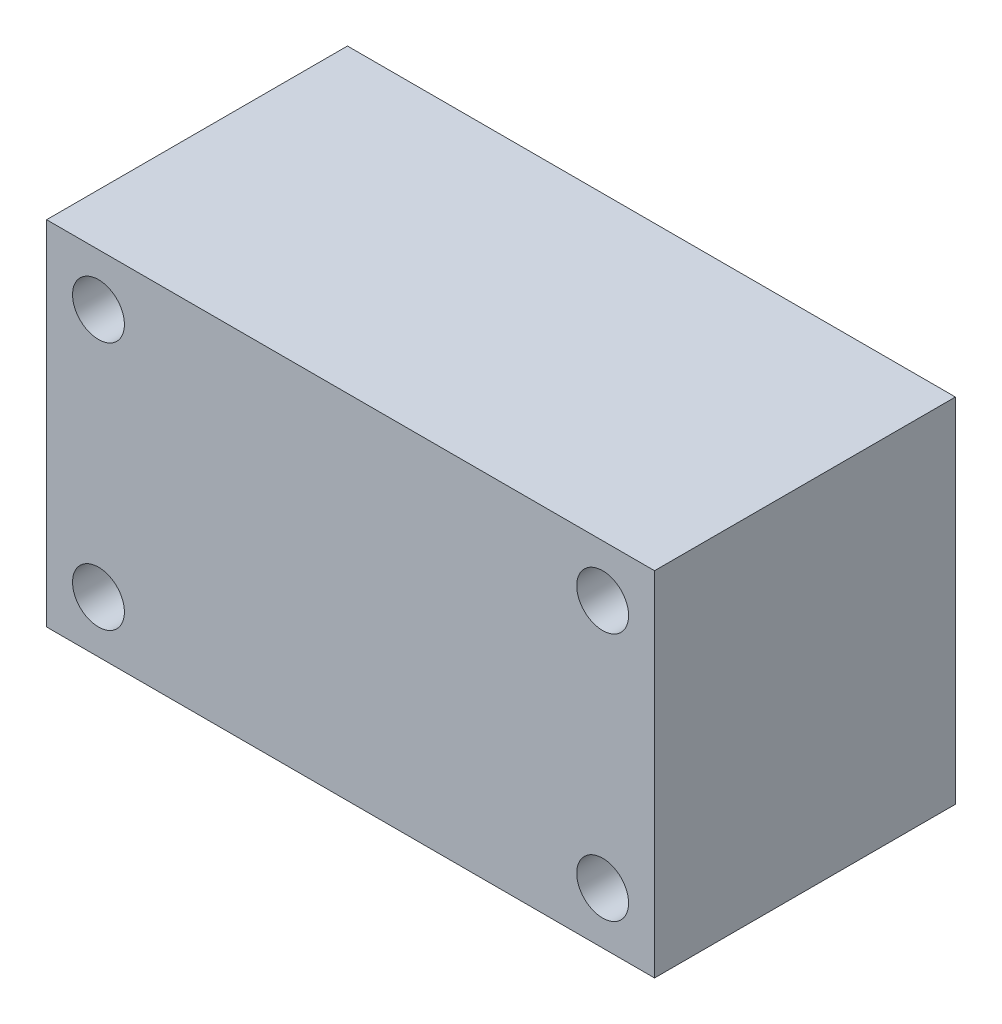
ISO-10303-21;
HEADER;
FILE_DESCRIPTION(('STEP AP214'),'2;1');
FILE_NAME('part.step','',(''),(''),'','','');
FILE_SCHEMA(('AUTOMOTIVE_DESIGN { 1 0 10303 214 1 1 1 1 }'));
ENDSEC;
DATA;
#1=APPLICATION_CONTEXT('core data for automotive mechanical design processes');
#2=APPLICATION_PROTOCOL_DEFINITION('international standard','automotive_design',2000,#1);
#3=PRODUCT_CONTEXT('',#1,'mechanical');
#4=PRODUCT('Part','Part','',(#3));
#5=PRODUCT_RELATED_PRODUCT_CATEGORY('part','',(#4));
#6=PRODUCT_DEFINITION_FORMATION('','',#4);
#7=PRODUCT_DEFINITION_CONTEXT('part definition',#1,'design');
#8=PRODUCT_DEFINITION('design','',#6,#7);
#9=PRODUCT_DEFINITION_SHAPE('','',#8);
#10=(LENGTH_UNIT() NAMED_UNIT(*) SI_UNIT(.MILLI.,.METRE.));
#11=(NAMED_UNIT(*) PLANE_ANGLE_UNIT() SI_UNIT($,.RADIAN.));
#12=(NAMED_UNIT(*) SI_UNIT($,.STERADIAN.) SOLID_ANGLE_UNIT());
#13=UNCERTAINTY_MEASURE_WITH_UNIT(LENGTH_MEASURE(1.E-05),#10,'distance_accuracy_value','');
#14=(GEOMETRIC_REPRESENTATION_CONTEXT(3) GLOBAL_UNCERTAINTY_ASSIGNED_CONTEXT((#13)) GLOBAL_UNIT_ASSIGNED_CONTEXT((#10,
#11,#12)) REPRESENTATION_CONTEXT('',''));
#15=CARTESIAN_POINT('',(0.,0.,0.));
#16=DIRECTION('',(0.,0.,1.));
#17=DIRECTION('',(1.,0.,0.));
#18=AXIS2_PLACEMENT_3D('',#15,#16,#17);
#19=CARTESIAN_POINT('',(12.15,6.,-20.5));
#20=DIRECTION('',(0.,0.,-1.));
#21=DIRECTION('',(1.,0.,0.));
#22=AXIS2_PLACEMENT_3D('',#19,#20,#21);
#23=CYLINDRICAL_SURFACE('',#22,1.25);
#24=CARTESIAN_POINT('',(12.15,6.,-19.5));
#25=DIRECTION('',(0.,0.,-1.));
#26=DIRECTION('',(1.,0.,0.));
#27=AXIS2_PLACEMENT_3D('',#24,#25,#26);
#28=CIRCLE('',#27,1.25);
#29=CARTESIAN_POINT('',(13.4,6.,-19.5));
#30=VERTEX_POINT('',#29);
#31=EDGE_CURVE('E86',#30,#30,#28,.T.);
#32=ORIENTED_EDGE('',*,*,#31,.T.);
#33=DIRECTION('',(0.,0.,1.));
#34=VECTOR('',#33,1.);
#35=CARTESIAN_POINT('',(13.4,6.,-20.5));
#36=LINE('',#35,#34);
#37=CARTESIAN_POINT('',(13.4,6.,-5.));
#38=VERTEX_POINT('',#37);
#39=EDGE_CURVE('E9',#30,#38,#36,.T.);
#40=ORIENTED_EDGE('',*,*,#39,.T.);
#41=CARTESIAN_POINT('',(12.15,6.,-5.));
#42=DIRECTION('',(0.,0.,-1.));
#43=DIRECTION('',(1.,0.,0.));
#44=AXIS2_PLACEMENT_3D('',#41,#42,#43);
#45=CIRCLE('',#44,1.25);
#46=EDGE_CURVE('E90',#38,#38,#45,.T.);
#47=ORIENTED_EDGE('',*,*,#46,.F.);
#48=ORIENTED_EDGE('',*,*,#39,.F.);
#49=EDGE_LOOP('',(#32,#40,#47,#48));
#50=FACE_BOUND('',#49,.T.);
#51=ADVANCED_FACE('F15',(#50),#23,.F.);
#52=CARTESIAN_POINT('',(-12.15,6.,-20.5));
#53=DIRECTION('',(0.,0.,-1.));
#54=DIRECTION('',(1.,0.,0.));
#55=AXIS2_PLACEMENT_3D('',#52,#53,#54);
#56=CYLINDRICAL_SURFACE('',#55,1.25);
#57=CARTESIAN_POINT('',(-12.15,6.,-19.5));
#58=DIRECTION('',(0.,0.,-1.));
#59=DIRECTION('',(1.,0.,0.));
#60=AXIS2_PLACEMENT_3D('',#57,#58,#59);
#61=CIRCLE('',#60,1.25);
#62=CARTESIAN_POINT('',(-10.9,6.,-19.5));
#63=VERTEX_POINT('',#62);
#64=EDGE_CURVE('E111',#63,#63,#61,.T.);
#65=ORIENTED_EDGE('',*,*,#64,.T.);
#66=DIRECTION('',(0.,0.,1.));
#67=VECTOR('',#66,1.);
#68=CARTESIAN_POINT('',(-10.9,6.,-20.5));
#69=LINE('',#68,#67);
#70=CARTESIAN_POINT('',(-10.9,6.,-5.));
#71=VERTEX_POINT('',#70);
#72=EDGE_CURVE('E24',#63,#71,#69,.T.);
#73=ORIENTED_EDGE('',*,*,#72,.T.);
#74=CARTESIAN_POINT('',(-12.15,6.,-5.));
#75=DIRECTION('',(0.,0.,-1.));
#76=DIRECTION('',(1.,0.,0.));
#77=AXIS2_PLACEMENT_3D('',#74,#75,#76);
#78=CIRCLE('',#77,1.25);
#79=EDGE_CURVE('E91',#71,#71,#78,.T.);
#80=ORIENTED_EDGE('',*,*,#79,.F.);
#81=ORIENTED_EDGE('',*,*,#72,.F.);
#82=EDGE_LOOP('',(#65,#73,#80,#81));
#83=FACE_BOUND('',#82,.T.);
#84=ADVANCED_FACE('F115',(#83),#56,.F.);
#85=CARTESIAN_POINT('',(12.15,-6.,-20.5));
#86=DIRECTION('',(0.,0.,-1.));
#87=DIRECTION('',(1.,0.,0.));
#88=AXIS2_PLACEMENT_3D('',#85,#86,#87);
#89=CYLINDRICAL_SURFACE('',#88,1.25);
#90=CARTESIAN_POINT('',(12.15,-6.,-19.5));
#91=DIRECTION('',(0.,0.,-1.));
#92=DIRECTION('',(1.,0.,0.));
#93=AXIS2_PLACEMENT_3D('',#90,#91,#92);
#94=CIRCLE('',#93,1.25);
#95=CARTESIAN_POINT('',(13.4,-6.,-19.5));
#96=VERTEX_POINT('',#95);
#97=EDGE_CURVE('E161',#96,#96,#94,.T.);
#98=ORIENTED_EDGE('',*,*,#97,.T.);
#99=DIRECTION('',(0.,0.,1.));
#100=VECTOR('',#99,1.);
#101=CARTESIAN_POINT('',(13.4,-6.,-20.5));
#102=LINE('',#101,#100);
#103=CARTESIAN_POINT('',(13.4,-6.,-5.));
#104=VERTEX_POINT('',#103);
#105=EDGE_CURVE('E97',#96,#104,#102,.T.);
#106=ORIENTED_EDGE('',*,*,#105,.T.);
#107=CARTESIAN_POINT('',(12.15,-6.,-5.));
#108=DIRECTION('',(0.,0.,-1.));
#109=DIRECTION('',(1.,0.,0.));
#110=AXIS2_PLACEMENT_3D('',#107,#108,#109);
#111=CIRCLE('',#110,1.25);
#112=EDGE_CURVE('E105',#104,#104,#111,.T.);
#113=ORIENTED_EDGE('',*,*,#112,.F.);
#114=ORIENTED_EDGE('',*,*,#105,.F.);
#115=EDGE_LOOP('',(#98,#106,#113,#114));
#116=FACE_BOUND('',#115,.T.);
#117=ADVANCED_FACE('F222',(#116),#89,.F.);
#118=CARTESIAN_POINT('',(-12.15,-6.,-20.5));
#119=DIRECTION('',(0.,0.,-1.));
#120=DIRECTION('',(1.,0.,0.));
#121=AXIS2_PLACEMENT_3D('',#118,#119,#120);
#122=CYLINDRICAL_SURFACE('',#121,1.25);
#123=CARTESIAN_POINT('',(-12.15,-6.,-19.5));
#124=DIRECTION('',(0.,0.,-1.));
#125=DIRECTION('',(1.,0.,0.));
#126=AXIS2_PLACEMENT_3D('',#123,#124,#125);
#127=CIRCLE('',#126,1.25);
#128=CARTESIAN_POINT('',(-10.9,-6.,-19.5));
#129=VERTEX_POINT('',#128);
#130=EDGE_CURVE('E173',#129,#129,#127,.T.);
#131=ORIENTED_EDGE('',*,*,#130,.T.);
#132=DIRECTION('',(0.,0.,1.));
#133=VECTOR('',#132,1.);
#134=CARTESIAN_POINT('',(-10.9,-6.,-20.5));
#135=LINE('',#134,#133);
#136=CARTESIAN_POINT('',(-10.9,-6.,-5.));
#137=VERTEX_POINT('',#136);
#138=EDGE_CURVE('E95',#129,#137,#135,.T.);
#139=ORIENTED_EDGE('',*,*,#138,.T.);
#140=CARTESIAN_POINT('',(-12.15,-6.,-5.));
#141=DIRECTION('',(0.,0.,-1.));
#142=DIRECTION('',(1.,0.,0.));
#143=AXIS2_PLACEMENT_3D('',#140,#141,#142);
#144=CIRCLE('',#143,1.25);
#145=EDGE_CURVE('E128',#137,#137,#144,.T.);
#146=ORIENTED_EDGE('',*,*,#145,.F.);
#147=ORIENTED_EDGE('',*,*,#138,.F.);
#148=EDGE_LOOP('',(#131,#139,#146,#147));
#149=FACE_BOUND('',#148,.T.);
#150=ADVANCED_FACE('F258',(#149),#122,.F.);
#151=CARTESIAN_POINT('',(14.65,8.5,-19.5));
#152=DIRECTION('',(0.,-1.,0.));
#153=DIRECTION('',(0.,0.,-1.));
#154=AXIS2_PLACEMENT_3D('',#151,#152,#153);
#155=PLANE('',#154);
#156=DIRECTION('',(-1.,0.,0.));
#157=VECTOR('',#156,1.);
#158=CARTESIAN_POINT('',(14.65,8.5,-19.5));
#159=LINE('',#158,#157);
#160=CARTESIAN_POINT('',(14.65,8.5,-19.5));
#161=VERTEX_POINT('',#160);
#162=CARTESIAN_POINT('',(-14.65,8.5,-19.5));
#163=VERTEX_POINT('',#162);
#164=EDGE_CURVE('E179',#161,#163,#159,.T.);
#165=ORIENTED_EDGE('',*,*,#164,.T.);
#166=DIRECTION('',(0.,0.,1.));
#167=VECTOR('',#166,1.);
#168=CARTESIAN_POINT('',(-14.65,8.5,-19.5));
#169=LINE('',#168,#167);
#170=CARTESIAN_POINT('',(-14.65,8.5,-5.));
#171=VERTEX_POINT('',#170);
#172=EDGE_CURVE('E163',#163,#171,#169,.T.);
#173=ORIENTED_EDGE('',*,*,#172,.T.);
#174=DIRECTION('',(-1.,0.,0.));
#175=VECTOR('',#174,1.);
#176=CARTESIAN_POINT('',(14.65,8.5,-5.));
#177=LINE('',#176,#175);
#178=CARTESIAN_POINT('',(14.65,8.5,-5.));
#179=VERTEX_POINT('',#178);
#180=EDGE_CURVE('E191',#179,#171,#177,.T.);
#181=ORIENTED_EDGE('',*,*,#180,.F.);
#182=DIRECTION('',(0.,0.,1.));
#183=VECTOR('',#182,1.);
#184=CARTESIAN_POINT('',(14.65,8.5,-19.5));
#185=LINE('',#184,#183);
#186=EDGE_CURVE('E162',#161,#179,#185,.T.);
#187=ORIENTED_EDGE('',*,*,#186,.F.);
#188=EDGE_LOOP('',(#165,#173,#181,#187));
#189=FACE_BOUND('',#188,.T.);
#190=ADVANCED_FACE('F120',(#189),#155,.F.);
#191=CARTESIAN_POINT('',(0.,0.,-5.));
#192=DIRECTION('',(0.,0.,1.));
#193=DIRECTION('',(1.,0.,0.));
#194=AXIS2_PLACEMENT_3D('',#191,#192,#193);
#195=PLANE('',#194);
#196=ORIENTED_EDGE('',*,*,#46,.T.);
#197=EDGE_LOOP('',(#196));
#198=FACE_BOUND('',#197,.T.);
#199=ORIENTED_EDGE('',*,*,#79,.T.);
#200=EDGE_LOOP('',(#199));
#201=FACE_BOUND('',#200,.T.);
#202=ORIENTED_EDGE('',*,*,#112,.T.);
#203=EDGE_LOOP('',(#202));
#204=FACE_BOUND('',#203,.T.);
#205=ORIENTED_EDGE('',*,*,#145,.T.);
#206=EDGE_LOOP('',(#205));
#207=FACE_BOUND('',#206,.T.);
#208=DIRECTION('',(1.,0.,0.));
#209=VECTOR('',#208,1.);
#210=CARTESIAN_POINT('',(-14.65,-8.5,-5.));
#211=LINE('',#210,#209);
#212=CARTESIAN_POINT('',(-14.65,-8.5,-5.));
#213=VERTEX_POINT('',#212);
#214=CARTESIAN_POINT('',(14.65,-8.5,-5.));
#215=VERTEX_POINT('',#214);
#216=EDGE_CURVE('E135',#213,#215,#211,.T.);
#217=ORIENTED_EDGE('',*,*,#216,.T.);
#218=DIRECTION('',(0.,1.,0.));
#219=VECTOR('',#218,1.);
#220=CARTESIAN_POINT('',(14.65,-8.5,-5.));
#221=LINE('',#220,#219);
#222=EDGE_CURVE('E133',#215,#179,#221,.T.);
#223=ORIENTED_EDGE('',*,*,#222,.T.);
#224=ORIENTED_EDGE('',*,*,#180,.T.);
#225=DIRECTION('',(0.,-1.,0.));
#226=VECTOR('',#225,1.);
#227=CARTESIAN_POINT('',(-14.65,8.5,-5.));
#228=LINE('',#227,#226);
#229=EDGE_CURVE('E140',#171,#213,#228,.T.);
#230=ORIENTED_EDGE('',*,*,#229,.T.);
#231=EDGE_LOOP('',(#217,#223,#224,#230));
#232=FACE_BOUND('',#231,.T.);
#233=ADVANCED_FACE('F116',(#198,#201,#204,#207,#232),#195,.T.);
#234=CARTESIAN_POINT('',(0.,0.,-19.5));
#235=DIRECTION('',(0.,0.,1.));
#236=DIRECTION('',(1.,0.,0.));
#237=AXIS2_PLACEMENT_3D('',#234,#235,#236);
#238=PLANE('',#237);
#239=ORIENTED_EDGE('',*,*,#31,.F.);
#240=EDGE_LOOP('',(#239));
#241=FACE_BOUND('',#240,.T.);
#242=ORIENTED_EDGE('',*,*,#64,.F.);
#243=EDGE_LOOP('',(#242));
#244=FACE_BOUND('',#243,.T.);
#245=ORIENTED_EDGE('',*,*,#97,.F.);
#246=EDGE_LOOP('',(#245));
#247=FACE_BOUND('',#246,.T.);
#248=ORIENTED_EDGE('',*,*,#130,.F.);
#249=EDGE_LOOP('',(#248));
#250=FACE_BOUND('',#249,.T.);
#251=DIRECTION('',(0.,-1.,0.));
#252=VECTOR('',#251,1.);
#253=CARTESIAN_POINT('',(-14.65,8.5,-19.5));
#254=LINE('',#253,#252);
#255=CARTESIAN_POINT('',(-14.65,-8.5,-19.5));
#256=VERTEX_POINT('',#255);
#257=EDGE_CURVE('E169',#163,#256,#254,.T.);
#258=ORIENTED_EDGE('',*,*,#257,.F.);
#259=ORIENTED_EDGE('',*,*,#164,.F.);
#260=DIRECTION('',(0.,1.,0.));
#261=VECTOR('',#260,1.);
#262=CARTESIAN_POINT('',(14.65,-8.5,-19.5));
#263=LINE('',#262,#261);
#264=CARTESIAN_POINT('',(14.65,-8.5,-19.5));
#265=VERTEX_POINT('',#264);
#266=EDGE_CURVE('E165',#265,#161,#263,.T.);
#267=ORIENTED_EDGE('',*,*,#266,.F.);
#268=DIRECTION('',(1.,0.,0.));
#269=VECTOR('',#268,1.);
#270=CARTESIAN_POINT('',(-14.65,-8.5,-19.5));
#271=LINE('',#270,#269);
#272=EDGE_CURVE('E149',#256,#265,#271,.T.);
#273=ORIENTED_EDGE('',*,*,#272,.F.);
#274=EDGE_LOOP('',(#258,#259,#267,#273));
#275=FACE_BOUND('',#274,.T.);
#276=ADVANCED_FACE('F118',(#241,#244,#247,#250,#275),#238,.F.);
#277=CARTESIAN_POINT('',(14.65,-8.5,-19.5));
#278=DIRECTION('',(-1.,0.,0.));
#279=DIRECTION('',(0.,0.,1.));
#280=AXIS2_PLACEMENT_3D('',#277,#278,#279);
#281=PLANE('',#280);
#282=ORIENTED_EDGE('',*,*,#266,.T.);
#283=ORIENTED_EDGE('',*,*,#186,.T.);
#284=ORIENTED_EDGE('',*,*,#222,.F.);
#285=DIRECTION('',(0.,0.,1.));
#286=VECTOR('',#285,1.);
#287=CARTESIAN_POINT('',(14.65,-8.5,-19.5));
#288=LINE('',#287,#286);
#289=EDGE_CURVE('E141',#265,#215,#288,.T.);
#290=ORIENTED_EDGE('',*,*,#289,.F.);
#291=EDGE_LOOP('',(#282,#283,#284,#290));
#292=FACE_BOUND('',#291,.T.);
#293=ADVANCED_FACE('F226',(#292),#281,.F.);
#294=CARTESIAN_POINT('',(-14.65,8.5,-19.5));
#295=DIRECTION('',(1.,0.,0.));
#296=DIRECTION('',(0.,1.,0.));
#297=AXIS2_PLACEMENT_3D('',#294,#295,#296);
#298=PLANE('',#297);
#299=ORIENTED_EDGE('',*,*,#257,.T.);
#300=DIRECTION('',(0.,0.,1.));
#301=VECTOR('',#300,1.);
#302=CARTESIAN_POINT('',(-14.65,-8.5,-19.5));
#303=LINE('',#302,#301);
#304=EDGE_CURVE('E142',#256,#213,#303,.T.);
#305=ORIENTED_EDGE('',*,*,#304,.T.);
#306=ORIENTED_EDGE('',*,*,#229,.F.);
#307=ORIENTED_EDGE('',*,*,#172,.F.);
#308=EDGE_LOOP('',(#299,#305,#306,#307));
#309=FACE_BOUND('',#308,.T.);
#310=ADVANCED_FACE('F233',(#309),#298,.F.);
#311=CARTESIAN_POINT('',(-14.65,-8.5,-19.5));
#312=DIRECTION('',(0.,1.,0.));
#313=DIRECTION('',(1.,0.,0.));
#314=AXIS2_PLACEMENT_3D('',#311,#312,#313);
#315=PLANE('',#314);
#316=ORIENTED_EDGE('',*,*,#272,.T.);
#317=ORIENTED_EDGE('',*,*,#289,.T.);
#318=ORIENTED_EDGE('',*,*,#216,.F.);
#319=ORIENTED_EDGE('',*,*,#304,.F.);
#320=EDGE_LOOP('',(#316,#317,#318,#319));
#321=FACE_BOUND('',#320,.T.);
#322=ADVANCED_FACE('F150',(#321),#315,.F.);
#323=CLOSED_SHELL('',(#51,#84,#117,#150,#190,#233,#276,#293,#310,#322));
#324=MANIFOLD_SOLID_BREP('B1',#323);
#325=ADVANCED_BREP_SHAPE_REPRESENTATION('',(#18,#324),#14);
#326=SHAPE_DEFINITION_REPRESENTATION(#9,#325);
ENDSEC;
END-ISO-10303-21;
